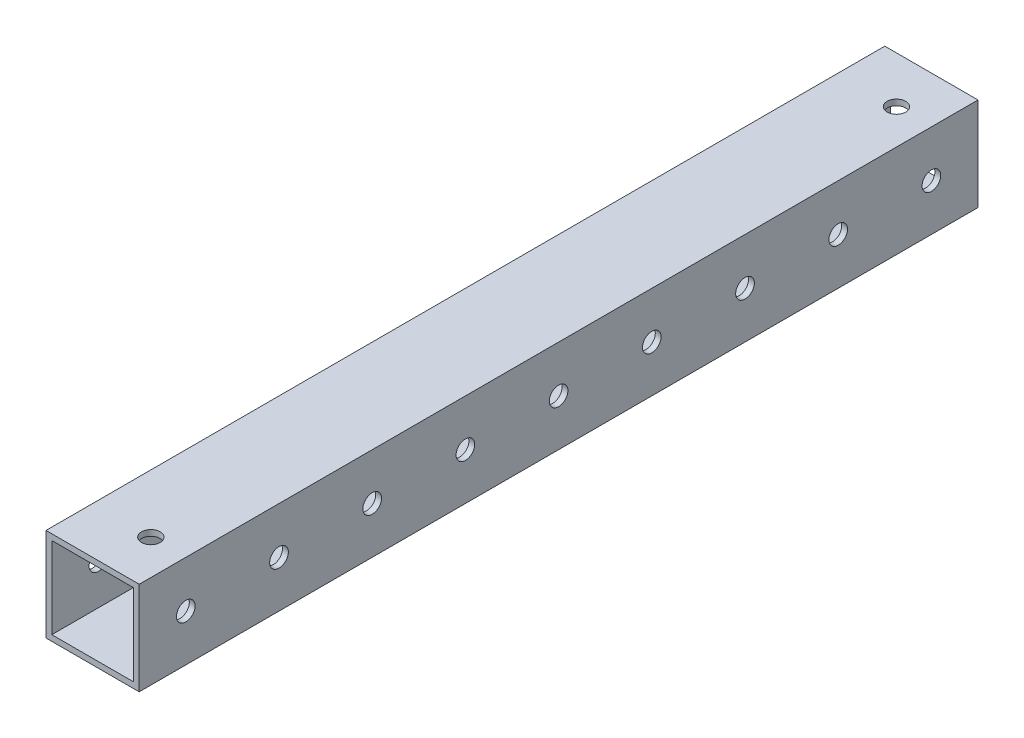
ISO-10303-21;
HEADER;
FILE_DESCRIPTION(('STEP AP214'),'2;1');
FILE_NAME('part.step','',(''),(''),'','','');
FILE_SCHEMA(('AUTOMOTIVE_DESIGN { 1 0 10303 214 1 1 1 1 }'));
ENDSEC;
DATA;
#1=APPLICATION_CONTEXT('core data for automotive mechanical design processes');
#2=APPLICATION_PROTOCOL_DEFINITION('international standard','automotive_design',2000,#1);
#3=PRODUCT_CONTEXT('',#1,'mechanical');
#4=PRODUCT('Part','Part','',(#3));
#5=PRODUCT_RELATED_PRODUCT_CATEGORY('part','',(#4));
#6=PRODUCT_DEFINITION_FORMATION('','',#4);
#7=PRODUCT_DEFINITION_CONTEXT('part definition',#1,'design');
#8=PRODUCT_DEFINITION('design','',#6,#7);
#9=PRODUCT_DEFINITION_SHAPE('','',#8);
#10=(LENGTH_UNIT() NAMED_UNIT(*) SI_UNIT(.MILLI.,.METRE.));
#11=(NAMED_UNIT(*) PLANE_ANGLE_UNIT() SI_UNIT($,.RADIAN.));
#12=(NAMED_UNIT(*) SI_UNIT($,.STERADIAN.) SOLID_ANGLE_UNIT());
#13=UNCERTAINTY_MEASURE_WITH_UNIT(LENGTH_MEASURE(1.E-05),#10,'distance_accuracy_value','');
#14=(GEOMETRIC_REPRESENTATION_CONTEXT(3) GLOBAL_UNCERTAINTY_ASSIGNED_CONTEXT((#13)) GLOBAL_UNIT_ASSIGNED_CONTEXT((#10,
#11,#12)) REPRESENTATION_CONTEXT('',''));
#15=CARTESIAN_POINT('',(0.,0.,0.));
#16=DIRECTION('',(0.,0.,1.));
#17=DIRECTION('',(1.,0.,0.));
#18=AXIS2_PLACEMENT_3D('',#15,#16,#17);
#19=CARTESIAN_POINT('',(0.,0.,228.6));
#20=DIRECTION('',(0.,0.,-1.));
#21=DIRECTION('',(-1.,0.,0.));
#22=AXIS2_PLACEMENT_3D('',#19,#20,#21);
#23=PLANE('',#22);
#24=DIRECTION('',(0.,-1.,0.));
#25=VECTOR('',#24,1.);
#26=CARTESIAN_POINT('',(0.,0.,228.6));
#27=LINE('',#26,#25);
#28=CARTESIAN_POINT('',(0.,25.4,228.6));
#29=VERTEX_POINT('',#28);
#30=CARTESIAN_POINT('',(0.,0.,228.6));
#31=VERTEX_POINT('',#30);
#32=EDGE_CURVE('E157',#29,#31,#27,.T.);
#33=ORIENTED_EDGE('',*,*,#32,.T.);
#34=DIRECTION('',(1.,0.,0.));
#35=VECTOR('',#34,1.);
#36=CARTESIAN_POINT('',(0.,0.,228.6));
#37=LINE('',#36,#35);
#38=CARTESIAN_POINT('',(25.4,0.,228.6));
#39=VERTEX_POINT('',#38);
#40=EDGE_CURVE('E161',#31,#39,#37,.T.);
#41=ORIENTED_EDGE('',*,*,#40,.T.);
#42=DIRECTION('',(0.,1.,0.));
#43=VECTOR('',#42,1.);
#44=CARTESIAN_POINT('',(25.4,0.,228.6));
#45=LINE('',#44,#43);
#46=CARTESIAN_POINT('',(25.4,25.4,228.6));
#47=VERTEX_POINT('',#46);
#48=EDGE_CURVE('E165',#39,#47,#45,.T.);
#49=ORIENTED_EDGE('',*,*,#48,.T.);
#50=DIRECTION('',(-1.,0.,0.));
#51=VECTOR('',#50,1.);
#52=CARTESIAN_POINT('',(0.,25.4,228.6));
#53=LINE('',#52,#51);
#54=EDGE_CURVE('E168',#47,#29,#53,.T.);
#55=ORIENTED_EDGE('',*,*,#54,.T.);
#56=EDGE_LOOP('',(#33,#41,#49,#55));
#57=FACE_BOUND('',#56,.T.);
#58=DIRECTION('',(0.,-1.,0.));
#59=VECTOR('',#58,1.);
#60=CARTESIAN_POINT('',(1.5875,1.5875,228.6));
#61=LINE('',#60,#59);
#62=CARTESIAN_POINT('',(1.5875,23.8125,228.6));
#63=VERTEX_POINT('',#62);
#64=CARTESIAN_POINT('',(1.5875,1.5875,228.6));
#65=VERTEX_POINT('',#64);
#66=EDGE_CURVE('E107',#63,#65,#61,.T.);
#67=ORIENTED_EDGE('',*,*,#66,.F.);
#68=DIRECTION('',(-1.,0.,0.));
#69=VECTOR('',#68,1.);
#70=CARTESIAN_POINT('',(1.5875,23.8125,228.6));
#71=LINE('',#70,#69);
#72=CARTESIAN_POINT('',(23.8125,23.8125,228.6));
#73=VERTEX_POINT('',#72);
#74=EDGE_CURVE('E133',#73,#63,#71,.T.);
#75=ORIENTED_EDGE('',*,*,#74,.F.);
#76=DIRECTION('',(0.,1.,0.));
#77=VECTOR('',#76,1.);
#78=CARTESIAN_POINT('',(23.8125,1.5875,228.6));
#79=LINE('',#78,#77);
#80=CARTESIAN_POINT('',(23.8125,1.5875,228.6));
#81=VERTEX_POINT('',#80);
#82=EDGE_CURVE('E129',#81,#73,#79,.T.);
#83=ORIENTED_EDGE('',*,*,#82,.F.);
#84=DIRECTION('',(1.,0.,0.));
#85=VECTOR('',#84,1.);
#86=CARTESIAN_POINT('',(1.5875,1.5875,228.6));
#87=LINE('',#86,#85);
#88=EDGE_CURVE('E116',#65,#81,#87,.T.);
#89=ORIENTED_EDGE('',*,*,#88,.F.);
#90=EDGE_LOOP('',(#67,#75,#83,#89));
#91=FACE_BOUND('',#90,.T.);
#92=ADVANCED_FACE('F39',(#57,#91),#23,.F.);
#93=CARTESIAN_POINT('',(0.,0.,0.));
#94=DIRECTION('',(0.,0.,-1.));
#95=DIRECTION('',(-1.,0.,0.));
#96=AXIS2_PLACEMENT_3D('',#93,#94,#95);
#97=PLANE('',#96);
#98=DIRECTION('',(0.,-1.,0.));
#99=VECTOR('',#98,1.);
#100=CARTESIAN_POINT('',(0.,0.,0.));
#101=LINE('',#100,#99);
#102=CARTESIAN_POINT('',(0.,25.4,0.));
#103=VERTEX_POINT('',#102);
#104=CARTESIAN_POINT('',(0.,0.,0.));
#105=VERTEX_POINT('',#104);
#106=EDGE_CURVE('E125',#103,#105,#101,.T.);
#107=ORIENTED_EDGE('',*,*,#106,.F.);
#108=DIRECTION('',(-1.,0.,0.));
#109=VECTOR('',#108,1.);
#110=CARTESIAN_POINT('',(0.,25.4,0.));
#111=LINE('',#110,#109);
#112=CARTESIAN_POINT('',(25.4,25.4,0.));
#113=VERTEX_POINT('',#112);
#114=EDGE_CURVE('E162',#113,#103,#111,.T.);
#115=ORIENTED_EDGE('',*,*,#114,.F.);
#116=DIRECTION('',(0.,1.,0.));
#117=VECTOR('',#116,1.);
#118=CARTESIAN_POINT('',(25.4,0.,0.));
#119=LINE('',#118,#117);
#120=CARTESIAN_POINT('',(25.4,0.,0.));
#121=VERTEX_POINT('',#120);
#122=EDGE_CURVE('E178',#121,#113,#119,.T.);
#123=ORIENTED_EDGE('',*,*,#122,.F.);
#124=DIRECTION('',(1.,0.,0.));
#125=VECTOR('',#124,1.);
#126=CARTESIAN_POINT('',(0.,0.,0.));
#127=LINE('',#126,#125);
#128=EDGE_CURVE('E175',#105,#121,#127,.T.);
#129=ORIENTED_EDGE('',*,*,#128,.F.);
#130=EDGE_LOOP('',(#107,#115,#123,#129));
#131=FACE_BOUND('',#130,.T.);
#132=DIRECTION('',(-1.,0.,0.));
#133=VECTOR('',#132,1.);
#134=CARTESIAN_POINT('',(1.5875,23.8125,0.));
#135=LINE('',#134,#133);
#136=CARTESIAN_POINT('',(23.8125,23.8125,0.));
#137=VERTEX_POINT('',#136);
#138=CARTESIAN_POINT('',(1.5875,23.8125,0.));
#139=VERTEX_POINT('',#138);
#140=EDGE_CURVE('E117',#137,#139,#135,.T.);
#141=ORIENTED_EDGE('',*,*,#140,.T.);
#142=DIRECTION('',(0.,-1.,0.));
#143=VECTOR('',#142,1.);
#144=CARTESIAN_POINT('',(1.5875,1.5875,0.));
#145=LINE('',#144,#143);
#146=CARTESIAN_POINT('',(1.5875,1.5875,0.));
#147=VERTEX_POINT('',#146);
#148=EDGE_CURVE('E65',#139,#147,#145,.T.);
#149=ORIENTED_EDGE('',*,*,#148,.T.);
#150=DIRECTION('',(1.,0.,0.));
#151=VECTOR('',#150,1.);
#152=CARTESIAN_POINT('',(1.5875,1.5875,0.));
#153=LINE('',#152,#151);
#154=CARTESIAN_POINT('',(23.8125,1.5875,0.));
#155=VERTEX_POINT('',#154);
#156=EDGE_CURVE('E123',#147,#155,#153,.T.);
#157=ORIENTED_EDGE('',*,*,#156,.T.);
#158=DIRECTION('',(0.,1.,0.));
#159=VECTOR('',#158,1.);
#160=CARTESIAN_POINT('',(23.8125,1.5875,0.));
#161=LINE('',#160,#159);
#162=EDGE_CURVE('E144',#155,#137,#161,.T.);
#163=ORIENTED_EDGE('',*,*,#162,.T.);
#164=EDGE_LOOP('',(#141,#149,#157,#163));
#165=FACE_BOUND('',#164,.T.);
#166=ADVANCED_FACE('F311',(#131,#165),#97,.T.);
#167=CARTESIAN_POINT('',(0.,0.,228.6));
#168=DIRECTION('',(1.,0.,0.));
#169=DIRECTION('',(0.,0.,-1.));
#170=AXIS2_PLACEMENT_3D('',#167,#168,#169);
#171=PLANE('',#170);
#172=CARTESIAN_POINT('',(0.,12.7,215.9));
#173=DIRECTION('',(1.,0.,0.));
#174=DIRECTION('',(0.,0.,-1.));
#175=AXIS2_PLACEMENT_3D('',#172,#173,#174);
#176=CIRCLE('',#175,2.53999999999998);
#177=CARTESIAN_POINT('',(0.,12.7,213.36));
#178=VERTEX_POINT('',#177);
#179=EDGE_CURVE('E208',#178,#178,#176,.T.);
#180=ORIENTED_EDGE('',*,*,#179,.T.);
#181=EDGE_LOOP('',(#180));
#182=FACE_BOUND('',#181,.T.);
#183=CARTESIAN_POINT('',(0.,12.7,190.5));
#184=DIRECTION('',(1.,0.,0.));
#185=DIRECTION('',(0.,0.,-1.));
#186=AXIS2_PLACEMENT_3D('',#183,#184,#185);
#187=CIRCLE('',#186,2.53999999999998);
#188=CARTESIAN_POINT('',(0.,12.7,187.96));
#189=VERTEX_POINT('',#188);
#190=EDGE_CURVE('E427',#189,#189,#187,.T.);
#191=ORIENTED_EDGE('',*,*,#190,.T.);
#192=EDGE_LOOP('',(#191));
#193=FACE_BOUND('',#192,.T.);
#194=CARTESIAN_POINT('',(0.,12.7,165.1));
#195=DIRECTION('',(1.,0.,0.));
#196=DIRECTION('',(0.,0.,-1.));
#197=AXIS2_PLACEMENT_3D('',#194,#195,#196);
#198=CIRCLE('',#197,2.54000000000001);
#199=CARTESIAN_POINT('',(0.,12.7,162.56));
#200=VERTEX_POINT('',#199);
#201=EDGE_CURVE('E431',#200,#200,#198,.T.);
#202=ORIENTED_EDGE('',*,*,#201,.T.);
#203=EDGE_LOOP('',(#202));
#204=FACE_BOUND('',#203,.T.);
#205=CARTESIAN_POINT('',(0.,12.7,139.7));
#206=DIRECTION('',(1.,0.,0.));
#207=DIRECTION('',(0.,0.,-1.));
#208=AXIS2_PLACEMENT_3D('',#205,#206,#207);
#209=CIRCLE('',#208,2.53999999999998);
#210=CARTESIAN_POINT('',(0.,12.7,137.16));
#211=VERTEX_POINT('',#210);
#212=EDGE_CURVE('E435',#211,#211,#209,.T.);
#213=ORIENTED_EDGE('',*,*,#212,.T.);
#214=EDGE_LOOP('',(#213));
#215=FACE_BOUND('',#214,.T.);
#216=CARTESIAN_POINT('',(0.,12.7,114.3));
#217=DIRECTION('',(1.,0.,0.));
#218=DIRECTION('',(0.,0.,-1.));
#219=AXIS2_PLACEMENT_3D('',#216,#217,#218);
#220=CIRCLE('',#219,2.53999999999998);
#221=CARTESIAN_POINT('',(0.,12.7,111.76));
#222=VERTEX_POINT('',#221);
#223=EDGE_CURVE('E439',#222,#222,#220,.T.);
#224=ORIENTED_EDGE('',*,*,#223,.T.);
#225=EDGE_LOOP('',(#224));
#226=FACE_BOUND('',#225,.T.);
#227=CARTESIAN_POINT('',(0.,12.7,88.9));
#228=DIRECTION('',(1.,0.,0.));
#229=DIRECTION('',(0.,0.,-1.));
#230=AXIS2_PLACEMENT_3D('',#227,#228,#229);
#231=CIRCLE('',#230,2.53999999999998);
#232=CARTESIAN_POINT('',(0.,12.7,86.36));
#233=VERTEX_POINT('',#232);
#234=EDGE_CURVE('E443',#233,#233,#231,.T.);
#235=ORIENTED_EDGE('',*,*,#234,.T.);
#236=EDGE_LOOP('',(#235));
#237=FACE_BOUND('',#236,.T.);
#238=CARTESIAN_POINT('',(0.,12.7,63.5));
#239=DIRECTION('',(1.,0.,0.));
#240=DIRECTION('',(0.,0.,-1.));
#241=AXIS2_PLACEMENT_3D('',#238,#239,#240);
#242=CIRCLE('',#241,2.53999999999998);
#243=CARTESIAN_POINT('',(0.,12.7,60.9600000000001));
#244=VERTEX_POINT('',#243);
#245=EDGE_CURVE('E447',#244,#244,#242,.T.);
#246=ORIENTED_EDGE('',*,*,#245,.T.);
#247=EDGE_LOOP('',(#246));
#248=FACE_BOUND('',#247,.T.);
#249=CARTESIAN_POINT('',(0.,12.7,38.1));
#250=DIRECTION('',(1.,0.,0.));
#251=DIRECTION('',(0.,0.,-1.));
#252=AXIS2_PLACEMENT_3D('',#249,#250,#251);
#253=CIRCLE('',#252,2.53999999999998);
#254=CARTESIAN_POINT('',(0.,12.7,35.56));
#255=VERTEX_POINT('',#254);
#256=EDGE_CURVE('E450',#255,#255,#253,.T.);
#257=ORIENTED_EDGE('',*,*,#256,.T.);
#258=EDGE_LOOP('',(#257));
#259=FACE_BOUND('',#258,.T.);
#260=CARTESIAN_POINT('',(0.,12.7,12.7));
#261=DIRECTION('',(1.,0.,0.));
#262=DIRECTION('',(0.,0.,-1.));
#263=AXIS2_PLACEMENT_3D('',#260,#261,#262);
#264=CIRCLE('',#263,2.53999999999998);
#265=CARTESIAN_POINT('',(0.,12.7,10.16));
#266=VERTEX_POINT('',#265);
#267=EDGE_CURVE('E372',#266,#266,#264,.T.);
#268=ORIENTED_EDGE('',*,*,#267,.T.);
#269=EDGE_LOOP('',(#268));
#270=FACE_BOUND('',#269,.T.);
#271=ORIENTED_EDGE('',*,*,#106,.T.);
#272=DIRECTION('',(0.,0.,-1.));
#273=VECTOR('',#272,1.);
#274=CARTESIAN_POINT('',(0.,0.,228.6));
#275=LINE('',#274,#273);
#276=EDGE_CURVE('E11',#31,#105,#275,.T.);
#277=ORIENTED_EDGE('',*,*,#276,.F.);
#278=ORIENTED_EDGE('',*,*,#32,.F.);
#279=DIRECTION('',(0.,0.,-1.));
#280=VECTOR('',#279,1.);
#281=CARTESIAN_POINT('',(0.,25.4,228.6));
#282=LINE('',#281,#280);
#283=EDGE_CURVE('E171',#29,#103,#282,.T.);
#284=ORIENTED_EDGE('',*,*,#283,.T.);
#285=EDGE_LOOP('',(#271,#277,#278,#284));
#286=FACE_BOUND('',#285,.T.);
#287=ADVANCED_FACE('F41',(#182,#193,#204,#215,#226,#237,#248,#259,#270,#286),#171,.F.);
#288=CARTESIAN_POINT('',(0.,0.,228.6));
#289=DIRECTION('',(0.,1.,0.));
#290=DIRECTION('',(0.,0.,1.));
#291=AXIS2_PLACEMENT_3D('',#288,#289,#290);
#292=PLANE('',#291);
#293=CARTESIAN_POINT('',(15.875,0.,215.9));
#294=DIRECTION('',(0.,1.,0.));
#295=DIRECTION('',(0.,0.,1.));
#296=AXIS2_PLACEMENT_3D('',#293,#294,#295);
#297=CIRCLE('',#296,2.53999999999996);
#298=CARTESIAN_POINT('',(15.875,0.,218.44));
#299=VERTEX_POINT('',#298);
#300=EDGE_CURVE('E198',#299,#299,#297,.T.);
#301=ORIENTED_EDGE('',*,*,#300,.T.);
#302=EDGE_LOOP('',(#301));
#303=FACE_BOUND('',#302,.T.);
#304=CARTESIAN_POINT('',(15.875,0.,12.7));
#305=DIRECTION('',(0.,1.,0.));
#306=DIRECTION('',(0.,0.,1.));
#307=AXIS2_PLACEMENT_3D('',#304,#305,#306);
#308=CIRCLE('',#307,2.54);
#309=CARTESIAN_POINT('',(15.875,0.,15.24));
#310=VERTEX_POINT('',#309);
#311=EDGE_CURVE('E267',#310,#310,#308,.T.);
#312=ORIENTED_EDGE('',*,*,#311,.T.);
#313=EDGE_LOOP('',(#312));
#314=FACE_BOUND('',#313,.T.);
#315=ORIENTED_EDGE('',*,*,#128,.T.);
#316=DIRECTION('',(0.,0.,-1.));
#317=VECTOR('',#316,1.);
#318=CARTESIAN_POINT('',(25.4,0.,228.6));
#319=LINE('',#318,#317);
#320=EDGE_CURVE('E49',#39,#121,#319,.T.);
#321=ORIENTED_EDGE('',*,*,#320,.F.);
#322=ORIENTED_EDGE('',*,*,#40,.F.);
#323=ORIENTED_EDGE('',*,*,#276,.T.);
#324=EDGE_LOOP('',(#315,#321,#322,#323));
#325=FACE_BOUND('',#324,.T.);
#326=ADVANCED_FACE('F297',(#303,#314,#325),#292,.F.);
#327=CARTESIAN_POINT('',(25.4,0.,228.6));
#328=DIRECTION('',(-1.,0.,0.));
#329=DIRECTION('',(0.,0.,1.));
#330=AXIS2_PLACEMENT_3D('',#327,#328,#329);
#331=PLANE('',#330);
#332=CARTESIAN_POINT('',(25.4,12.7,215.9));
#333=DIRECTION('',(1.,0.,0.));
#334=DIRECTION('',(0.,0.,-1.));
#335=AXIS2_PLACEMENT_3D('',#332,#333,#334);
#336=CIRCLE('',#335,2.53999999999998);
#337=CARTESIAN_POINT('',(25.4,12.7,213.36));
#338=VERTEX_POINT('',#337);
#339=EDGE_CURVE('E338',#338,#338,#336,.T.);
#340=ORIENTED_EDGE('',*,*,#339,.F.);
#341=EDGE_LOOP('',(#340));
#342=FACE_BOUND('',#341,.T.);
#343=CARTESIAN_POINT('',(25.4,12.7,190.5));
#344=DIRECTION('',(1.,0.,0.));
#345=DIRECTION('',(0.,0.,-1.));
#346=AXIS2_PLACEMENT_3D('',#343,#344,#345);
#347=CIRCLE('',#346,2.53999999999998);
#348=CARTESIAN_POINT('',(25.4,12.7,187.96));
#349=VERTEX_POINT('',#348);
#350=EDGE_CURVE('E342',#349,#349,#347,.T.);
#351=ORIENTED_EDGE('',*,*,#350,.F.);
#352=EDGE_LOOP('',(#351));
#353=FACE_BOUND('',#352,.T.);
#354=CARTESIAN_POINT('',(25.4,12.7,165.1));
#355=DIRECTION('',(1.,0.,0.));
#356=DIRECTION('',(0.,0.,-1.));
#357=AXIS2_PLACEMENT_3D('',#354,#355,#356);
#358=CIRCLE('',#357,2.54000000000001);
#359=CARTESIAN_POINT('',(25.4,12.7,162.56));
#360=VERTEX_POINT('',#359);
#361=EDGE_CURVE('E346',#360,#360,#358,.T.);
#362=ORIENTED_EDGE('',*,*,#361,.F.);
#363=EDGE_LOOP('',(#362));
#364=FACE_BOUND('',#363,.T.);
#365=CARTESIAN_POINT('',(25.4,12.7,139.7));
#366=DIRECTION('',(1.,0.,0.));
#367=DIRECTION('',(0.,0.,-1.));
#368=AXIS2_PLACEMENT_3D('',#365,#366,#367);
#369=CIRCLE('',#368,2.53999999999998);
#370=CARTESIAN_POINT('',(25.4,12.7,137.16));
#371=VERTEX_POINT('',#370);
#372=EDGE_CURVE('E350',#371,#371,#369,.T.);
#373=ORIENTED_EDGE('',*,*,#372,.F.);
#374=EDGE_LOOP('',(#373));
#375=FACE_BOUND('',#374,.T.);
#376=CARTESIAN_POINT('',(25.4,12.7,114.3));
#377=DIRECTION('',(1.,0.,0.));
#378=DIRECTION('',(0.,0.,-1.));
#379=AXIS2_PLACEMENT_3D('',#376,#377,#378);
#380=CIRCLE('',#379,2.53999999999998);
#381=CARTESIAN_POINT('',(25.4,12.7,111.76));
#382=VERTEX_POINT('',#381);
#383=EDGE_CURVE('E354',#382,#382,#380,.T.);
#384=ORIENTED_EDGE('',*,*,#383,.F.);
#385=EDGE_LOOP('',(#384));
#386=FACE_BOUND('',#385,.T.);
#387=CARTESIAN_POINT('',(25.4,12.7,88.9));
#388=DIRECTION('',(1.,0.,0.));
#389=DIRECTION('',(0.,0.,-1.));
#390=AXIS2_PLACEMENT_3D('',#387,#388,#389);
#391=CIRCLE('',#390,2.53999999999998);
#392=CARTESIAN_POINT('',(25.4,12.7,86.36));
#393=VERTEX_POINT('',#392);
#394=EDGE_CURVE('E358',#393,#393,#391,.T.);
#395=ORIENTED_EDGE('',*,*,#394,.F.);
#396=EDGE_LOOP('',(#395));
#397=FACE_BOUND('',#396,.T.);
#398=CARTESIAN_POINT('',(25.4,12.7,63.5));
#399=DIRECTION('',(1.,0.,0.));
#400=DIRECTION('',(0.,0.,-1.));
#401=AXIS2_PLACEMENT_3D('',#398,#399,#400);
#402=CIRCLE('',#401,2.53999999999998);
#403=CARTESIAN_POINT('',(25.4,12.7,60.9600000000001));
#404=VERTEX_POINT('',#403);
#405=EDGE_CURVE('E362',#404,#404,#402,.T.);
#406=ORIENTED_EDGE('',*,*,#405,.F.);
#407=EDGE_LOOP('',(#406));
#408=FACE_BOUND('',#407,.T.);
#409=CARTESIAN_POINT('',(25.4,12.7,38.1));
#410=DIRECTION('',(1.,0.,0.));
#411=DIRECTION('',(0.,0.,-1.));
#412=AXIS2_PLACEMENT_3D('',#409,#410,#411);
#413=CIRCLE('',#412,2.53999999999998);
#414=CARTESIAN_POINT('',(25.4,12.7,35.56));
#415=VERTEX_POINT('',#414);
#416=EDGE_CURVE('E366',#415,#415,#413,.T.);
#417=ORIENTED_EDGE('',*,*,#416,.F.);
#418=EDGE_LOOP('',(#417));
#419=FACE_BOUND('',#418,.T.);
#420=CARTESIAN_POINT('',(25.4,12.7,12.7));
#421=DIRECTION('',(1.,0.,0.));
#422=DIRECTION('',(0.,0.,-1.));
#423=AXIS2_PLACEMENT_3D('',#420,#421,#422);
#424=CIRCLE('',#423,2.53999999999998);
#425=CARTESIAN_POINT('',(25.4,12.7,10.16));
#426=VERTEX_POINT('',#425);
#427=EDGE_CURVE('E369',#426,#426,#424,.T.);
#428=ORIENTED_EDGE('',*,*,#427,.F.);
#429=EDGE_LOOP('',(#428));
#430=FACE_BOUND('',#429,.T.);
#431=ORIENTED_EDGE('',*,*,#122,.T.);
#432=DIRECTION('',(0.,0.,-1.));
#433=VECTOR('',#432,1.);
#434=CARTESIAN_POINT('',(25.4,25.4,228.6));
#435=LINE('',#434,#433);
#436=EDGE_CURVE('E186',#47,#113,#435,.T.);
#437=ORIENTED_EDGE('',*,*,#436,.F.);
#438=ORIENTED_EDGE('',*,*,#48,.F.);
#439=ORIENTED_EDGE('',*,*,#320,.T.);
#440=EDGE_LOOP('',(#431,#437,#438,#439));
#441=FACE_BOUND('',#440,.T.);
#442=ADVANCED_FACE('F300',(#342,#353,#364,#375,#386,#397,#408,#419,#430,#441),#331,.F.);
#443=CARTESIAN_POINT('',(0.,25.4,228.6));
#444=DIRECTION('',(0.,-1.,0.));
#445=DIRECTION('',(0.,0.,-1.));
#446=AXIS2_PLACEMENT_3D('',#443,#444,#445);
#447=PLANE('',#446);
#448=CARTESIAN_POINT('',(15.875,25.4,215.9));
#449=DIRECTION('',(0.,1.,0.));
#450=DIRECTION('',(0.,0.,1.));
#451=AXIS2_PLACEMENT_3D('',#448,#449,#450);
#452=CIRCLE('',#451,2.53999999999996);
#453=CARTESIAN_POINT('',(15.875,25.4,218.44));
#454=VERTEX_POINT('',#453);
#455=EDGE_CURVE('E263',#454,#454,#452,.T.);
#456=ORIENTED_EDGE('',*,*,#455,.F.);
#457=EDGE_LOOP('',(#456));
#458=FACE_BOUND('',#457,.T.);
#459=CARTESIAN_POINT('',(15.875,25.4,12.7));
#460=DIRECTION('',(0.,1.,0.));
#461=DIRECTION('',(0.,0.,1.));
#462=AXIS2_PLACEMENT_3D('',#459,#460,#461);
#463=CIRCLE('',#462,2.54);
#464=CARTESIAN_POINT('',(15.875,25.4,15.24));
#465=VERTEX_POINT('',#464);
#466=EDGE_CURVE('E259',#465,#465,#463,.T.);
#467=ORIENTED_EDGE('',*,*,#466,.F.);
#468=EDGE_LOOP('',(#467));
#469=FACE_BOUND('',#468,.T.);
#470=ORIENTED_EDGE('',*,*,#114,.T.);
#471=ORIENTED_EDGE('',*,*,#283,.F.);
#472=ORIENTED_EDGE('',*,*,#54,.F.);
#473=ORIENTED_EDGE('',*,*,#436,.T.);
#474=EDGE_LOOP('',(#470,#471,#472,#473));
#475=FACE_BOUND('',#474,.T.);
#476=ADVANCED_FACE('F315',(#458,#469,#475),#447,.F.);
#477=CARTESIAN_POINT('',(1.5875,1.5875,228.6));
#478=DIRECTION('',(1.,0.,0.));
#479=DIRECTION('',(0.,0.,-1.));
#480=AXIS2_PLACEMENT_3D('',#477,#478,#479);
#481=PLANE('',#480);
#482=CARTESIAN_POINT('',(1.5875,12.7,215.9));
#483=DIRECTION('',(1.,0.,0.));
#484=DIRECTION('',(0.,0.,-1.));
#485=AXIS2_PLACEMENT_3D('',#482,#483,#484);
#486=CIRCLE('',#485,2.53999999999998);
#487=CARTESIAN_POINT('',(1.5875,12.7,213.36));
#488=VERTEX_POINT('',#487);
#489=EDGE_CURVE('E255',#488,#488,#486,.T.);
#490=ORIENTED_EDGE('',*,*,#489,.F.);
#491=EDGE_LOOP('',(#490));
#492=FACE_BOUND('',#491,.T.);
#493=CARTESIAN_POINT('',(1.5875,12.7,190.5));
#494=DIRECTION('',(1.,0.,0.));
#495=DIRECTION('',(0.,0.,-1.));
#496=AXIS2_PLACEMENT_3D('',#493,#494,#495);
#497=CIRCLE('',#496,2.53999999999998);
#498=CARTESIAN_POINT('',(1.5875,12.7,187.96));
#499=VERTEX_POINT('',#498);
#500=EDGE_CURVE('E241',#499,#499,#497,.T.);
#501=ORIENTED_EDGE('',*,*,#500,.F.);
#502=EDGE_LOOP('',(#501));
#503=FACE_BOUND('',#502,.T.);
#504=CARTESIAN_POINT('',(1.5875,12.7,165.1));
#505=DIRECTION('',(1.,0.,0.));
#506=DIRECTION('',(0.,0.,-1.));
#507=AXIS2_PLACEMENT_3D('',#504,#505,#506);
#508=CIRCLE('',#507,2.54000000000001);
#509=CARTESIAN_POINT('',(1.5875,12.7,162.56));
#510=VERTEX_POINT('',#509);
#511=EDGE_CURVE('E237',#510,#510,#508,.T.);
#512=ORIENTED_EDGE('',*,*,#511,.F.);
#513=EDGE_LOOP('',(#512));
#514=FACE_BOUND('',#513,.T.);
#515=CARTESIAN_POINT('',(1.5875,12.7,139.7));
#516=DIRECTION('',(1.,0.,0.));
#517=DIRECTION('',(0.,0.,-1.));
#518=AXIS2_PLACEMENT_3D('',#515,#516,#517);
#519=CIRCLE('',#518,2.53999999999998);
#520=CARTESIAN_POINT('',(1.5875,12.7,137.16));
#521=VERTEX_POINT('',#520);
#522=EDGE_CURVE('E233',#521,#521,#519,.T.);
#523=ORIENTED_EDGE('',*,*,#522,.F.);
#524=EDGE_LOOP('',(#523));
#525=FACE_BOUND('',#524,.T.);
#526=CARTESIAN_POINT('',(1.5875,12.7,114.3));
#527=DIRECTION('',(1.,0.,0.));
#528=DIRECTION('',(0.,0.,-1.));
#529=AXIS2_PLACEMENT_3D('',#526,#527,#528);
#530=CIRCLE('',#529,2.53999999999998);
#531=CARTESIAN_POINT('',(1.5875,12.7,111.76));
#532=VERTEX_POINT('',#531);
#533=EDGE_CURVE('E228',#532,#532,#530,.T.);
#534=ORIENTED_EDGE('',*,*,#533,.F.);
#535=EDGE_LOOP('',(#534));
#536=FACE_BOUND('',#535,.T.);
#537=CARTESIAN_POINT('',(1.5875,12.7,88.9));
#538=DIRECTION('',(1.,0.,0.));
#539=DIRECTION('',(0.,0.,-1.));
#540=AXIS2_PLACEMENT_3D('',#537,#538,#539);
#541=CIRCLE('',#540,2.53999999999998);
#542=CARTESIAN_POINT('',(1.5875,12.7,86.36));
#543=VERTEX_POINT('',#542);
#544=EDGE_CURVE('E223',#543,#543,#541,.T.);
#545=ORIENTED_EDGE('',*,*,#544,.F.);
#546=EDGE_LOOP('',(#545));
#547=FACE_BOUND('',#546,.T.);
#548=CARTESIAN_POINT('',(1.5875,12.7,63.5));
#549=DIRECTION('',(1.,0.,0.));
#550=DIRECTION('',(0.,0.,-1.));
#551=AXIS2_PLACEMENT_3D('',#548,#549,#550);
#552=CIRCLE('',#551,2.53999999999998);
#553=CARTESIAN_POINT('',(1.5875,12.7,60.9600000000001));
#554=VERTEX_POINT('',#553);
#555=EDGE_CURVE('E218',#554,#554,#552,.T.);
#556=ORIENTED_EDGE('',*,*,#555,.F.);
#557=EDGE_LOOP('',(#556));
#558=FACE_BOUND('',#557,.T.);
#559=CARTESIAN_POINT('',(1.5875,12.7,38.1));
#560=DIRECTION('',(1.,0.,0.));
#561=DIRECTION('',(0.,0.,-1.));
#562=AXIS2_PLACEMENT_3D('',#559,#560,#561);
#563=CIRCLE('',#562,2.53999999999998);
#564=CARTESIAN_POINT('',(1.5875,12.7,35.56));
#565=VERTEX_POINT('',#564);
#566=EDGE_CURVE('E213',#565,#565,#563,.T.);
#567=ORIENTED_EDGE('',*,*,#566,.F.);
#568=EDGE_LOOP('',(#567));
#569=FACE_BOUND('',#568,.T.);
#570=CARTESIAN_POINT('',(1.5875,12.7,12.7));
#571=DIRECTION('',(1.,0.,0.));
#572=DIRECTION('',(0.,0.,-1.));
#573=AXIS2_PLACEMENT_3D('',#570,#571,#572);
#574=CIRCLE('',#573,2.53999999999998);
#575=CARTESIAN_POINT('',(1.5875,12.7,10.16));
#576=VERTEX_POINT('',#575);
#577=EDGE_CURVE('E207',#576,#576,#574,.T.);
#578=ORIENTED_EDGE('',*,*,#577,.F.);
#579=EDGE_LOOP('',(#578));
#580=FACE_BOUND('',#579,.T.);
#581=ORIENTED_EDGE('',*,*,#148,.F.);
#582=DIRECTION('',(0.,0.,-1.));
#583=VECTOR('',#582,1.);
#584=CARTESIAN_POINT('',(1.5875,23.8125,228.6));
#585=LINE('',#584,#583);
#586=EDGE_CURVE('E111',#63,#139,#585,.T.);
#587=ORIENTED_EDGE('',*,*,#586,.F.);
#588=ORIENTED_EDGE('',*,*,#66,.T.);
#589=DIRECTION('',(0.,0.,-1.));
#590=VECTOR('',#589,1.);
#591=CARTESIAN_POINT('',(1.5875,1.5875,228.6));
#592=LINE('',#591,#590);
#593=EDGE_CURVE('E110',#65,#147,#592,.T.);
#594=ORIENTED_EDGE('',*,*,#593,.T.);
#595=EDGE_LOOP('',(#581,#587,#588,#594));
#596=FACE_BOUND('',#595,.T.);
#597=ADVANCED_FACE('F109',(#492,#503,#514,#525,#536,#547,#558,#569,#580,#596),#481,.T.);
#598=CARTESIAN_POINT('',(1.5875,1.5875,228.6));
#599=DIRECTION('',(0.,1.,0.));
#600=DIRECTION('',(0.,0.,1.));
#601=AXIS2_PLACEMENT_3D('',#598,#599,#600);
#602=PLANE('',#601);
#603=CARTESIAN_POINT('',(15.875,1.5875,215.9));
#604=DIRECTION('',(0.,1.,0.));
#605=DIRECTION('',(0.,0.,1.));
#606=AXIS2_PLACEMENT_3D('',#603,#604,#605);
#607=CIRCLE('',#606,2.53999999999996);
#608=CARTESIAN_POINT('',(15.875,1.5875,218.44));
#609=VERTEX_POINT('',#608);
#610=EDGE_CURVE('E141',#609,#609,#607,.T.);
#611=ORIENTED_EDGE('',*,*,#610,.F.);
#612=EDGE_LOOP('',(#611));
#613=FACE_BOUND('',#612,.T.);
#614=CARTESIAN_POINT('',(15.875,1.5875,12.7));
#615=DIRECTION('',(0.,1.,0.));
#616=DIRECTION('',(0.,0.,1.));
#617=AXIS2_PLACEMENT_3D('',#614,#615,#616);
#618=CIRCLE('',#617,2.54);
#619=CARTESIAN_POINT('',(15.875,1.5875,15.24));
#620=VERTEX_POINT('',#619);
#621=EDGE_CURVE('E197',#620,#620,#618,.T.);
#622=ORIENTED_EDGE('',*,*,#621,.F.);
#623=EDGE_LOOP('',(#622));
#624=FACE_BOUND('',#623,.T.);
#625=ORIENTED_EDGE('',*,*,#156,.F.);
#626=ORIENTED_EDGE('',*,*,#593,.F.);
#627=ORIENTED_EDGE('',*,*,#88,.T.);
#628=DIRECTION('',(0.,0.,-1.));
#629=VECTOR('',#628,1.);
#630=CARTESIAN_POINT('',(23.8125,1.5875,228.6));
#631=LINE('',#630,#629);
#632=EDGE_CURVE('E126',#81,#155,#631,.T.);
#633=ORIENTED_EDGE('',*,*,#632,.T.);
#634=EDGE_LOOP('',(#625,#626,#627,#633));
#635=FACE_BOUND('',#634,.T.);
#636=ADVANCED_FACE('F120',(#613,#624,#635),#602,.T.);
#637=CARTESIAN_POINT('',(23.8125,1.5875,228.6));
#638=DIRECTION('',(-1.,0.,0.));
#639=DIRECTION('',(0.,0.,1.));
#640=AXIS2_PLACEMENT_3D('',#637,#638,#639);
#641=PLANE('',#640);
#642=CARTESIAN_POINT('',(23.8125,12.7,215.9));
#643=DIRECTION('',(-1.,0.,0.));
#644=DIRECTION('',(0.,0.,1.));
#645=AXIS2_PLACEMENT_3D('',#642,#643,#644);
#646=CIRCLE('',#645,2.53999999999998);
#647=CARTESIAN_POINT('',(23.8125,12.7,218.44));
#648=VERTEX_POINT('',#647);
#649=EDGE_CURVE('E43',#648,#648,#646,.T.);
#650=ORIENTED_EDGE('',*,*,#649,.F.);
#651=EDGE_LOOP('',(#650));
#652=FACE_BOUND('',#651,.T.);
#653=CARTESIAN_POINT('',(23.8125,12.7,190.5));
#654=DIRECTION('',(-1.,0.,0.));
#655=DIRECTION('',(0.,0.,1.));
#656=AXIS2_PLACEMENT_3D('',#653,#654,#655);
#657=CIRCLE('',#656,2.53999999999998);
#658=CARTESIAN_POINT('',(23.8125,12.7,193.04));
#659=VERTEX_POINT('',#658);
#660=EDGE_CURVE('E238',#659,#659,#657,.T.);
#661=ORIENTED_EDGE('',*,*,#660,.F.);
#662=EDGE_LOOP('',(#661));
#663=FACE_BOUND('',#662,.T.);
#664=CARTESIAN_POINT('',(23.8125,12.7,165.1));
#665=DIRECTION('',(-1.,0.,0.));
#666=DIRECTION('',(0.,0.,1.));
#667=AXIS2_PLACEMENT_3D('',#664,#665,#666);
#668=CIRCLE('',#667,2.54000000000001);
#669=CARTESIAN_POINT('',(23.8125,12.7,167.64));
#670=VERTEX_POINT('',#669);
#671=EDGE_CURVE('E234',#670,#670,#668,.T.);
#672=ORIENTED_EDGE('',*,*,#671,.F.);
#673=EDGE_LOOP('',(#672));
#674=FACE_BOUND('',#673,.T.);
#675=CARTESIAN_POINT('',(23.8125,12.7,139.7));
#676=DIRECTION('',(-1.,0.,0.));
#677=DIRECTION('',(0.,0.,1.));
#678=AXIS2_PLACEMENT_3D('',#675,#676,#677);
#679=CIRCLE('',#678,2.53999999999998);
#680=CARTESIAN_POINT('',(23.8125,12.7,142.24));
#681=VERTEX_POINT('',#680);
#682=EDGE_CURVE('E229',#681,#681,#679,.T.);
#683=ORIENTED_EDGE('',*,*,#682,.F.);
#684=EDGE_LOOP('',(#683));
#685=FACE_BOUND('',#684,.T.);
#686=CARTESIAN_POINT('',(23.8125,12.7,114.3));
#687=DIRECTION('',(-1.,0.,0.));
#688=DIRECTION('',(0.,0.,1.));
#689=AXIS2_PLACEMENT_3D('',#686,#687,#688);
#690=CIRCLE('',#689,2.53999999999998);
#691=CARTESIAN_POINT('',(23.8125,12.7,116.84));
#692=VERTEX_POINT('',#691);
#693=EDGE_CURVE('E224',#692,#692,#690,.T.);
#694=ORIENTED_EDGE('',*,*,#693,.F.);
#695=EDGE_LOOP('',(#694));
#696=FACE_BOUND('',#695,.T.);
#697=CARTESIAN_POINT('',(23.8125,12.7,88.9));
#698=DIRECTION('',(-1.,0.,0.));
#699=DIRECTION('',(0.,0.,1.));
#700=AXIS2_PLACEMENT_3D('',#697,#698,#699);
#701=CIRCLE('',#700,2.53999999999998);
#702=CARTESIAN_POINT('',(23.8125,12.7,91.44));
#703=VERTEX_POINT('',#702);
#704=EDGE_CURVE('E219',#703,#703,#701,.T.);
#705=ORIENTED_EDGE('',*,*,#704,.F.);
#706=EDGE_LOOP('',(#705));
#707=FACE_BOUND('',#706,.T.);
#708=CARTESIAN_POINT('',(23.8125,12.7,63.5));
#709=DIRECTION('',(-1.,0.,0.));
#710=DIRECTION('',(0.,0.,1.));
#711=AXIS2_PLACEMENT_3D('',#708,#709,#710);
#712=CIRCLE('',#711,2.53999999999998);
#713=CARTESIAN_POINT('',(23.8125,12.7,66.04));
#714=VERTEX_POINT('',#713);
#715=EDGE_CURVE('E214',#714,#714,#712,.T.);
#716=ORIENTED_EDGE('',*,*,#715,.F.);
#717=EDGE_LOOP('',(#716));
#718=FACE_BOUND('',#717,.T.);
#719=CARTESIAN_POINT('',(23.8125,12.7,38.1));
#720=DIRECTION('',(-1.,0.,0.));
#721=DIRECTION('',(0.,0.,1.));
#722=AXIS2_PLACEMENT_3D('',#719,#720,#721);
#723=CIRCLE('',#722,2.53999999999998);
#724=CARTESIAN_POINT('',(23.8125,12.7,40.64));
#725=VERTEX_POINT('',#724);
#726=EDGE_CURVE('E209',#725,#725,#723,.T.);
#727=ORIENTED_EDGE('',*,*,#726,.F.);
#728=EDGE_LOOP('',(#727));
#729=FACE_BOUND('',#728,.T.);
#730=CARTESIAN_POINT('',(23.8125,12.7,12.7));
#731=DIRECTION('',(-1.,0.,0.));
#732=DIRECTION('',(0.,0.,1.));
#733=AXIS2_PLACEMENT_3D('',#730,#731,#732);
#734=CIRCLE('',#733,2.53999999999998);
#735=CARTESIAN_POINT('',(23.8125,12.7,15.24));
#736=VERTEX_POINT('',#735);
#737=EDGE_CURVE('E203',#736,#736,#734,.T.);
#738=ORIENTED_EDGE('',*,*,#737,.F.);
#739=EDGE_LOOP('',(#738));
#740=FACE_BOUND('',#739,.T.);
#741=ORIENTED_EDGE('',*,*,#162,.F.);
#742=ORIENTED_EDGE('',*,*,#632,.F.);
#743=ORIENTED_EDGE('',*,*,#82,.T.);
#744=DIRECTION('',(0.,0.,-1.));
#745=VECTOR('',#744,1.);
#746=CARTESIAN_POINT('',(23.8125,23.8125,228.6));
#747=LINE('',#746,#745);
#748=EDGE_CURVE('E57',#73,#137,#747,.T.);
#749=ORIENTED_EDGE('',*,*,#748,.T.);
#750=EDGE_LOOP('',(#741,#742,#743,#749));
#751=FACE_BOUND('',#750,.T.);
#752=ADVANCED_FACE('F285',(#652,#663,#674,#685,#696,#707,#718,#729,#740,#751),#641,.T.);
#753=CARTESIAN_POINT('',(1.5875,23.8125,228.6));
#754=DIRECTION('',(0.,-1.,0.));
#755=DIRECTION('',(0.,0.,-1.));
#756=AXIS2_PLACEMENT_3D('',#753,#754,#755);
#757=PLANE('',#756);
#758=CARTESIAN_POINT('',(15.875,23.8125,215.9));
#759=DIRECTION('',(0.,-1.,0.));
#760=DIRECTION('',(0.,0.,-1.));
#761=AXIS2_PLACEMENT_3D('',#758,#759,#760);
#762=CIRCLE('',#761,2.53999999999996);
#763=CARTESIAN_POINT('',(15.875,23.8125,213.36));
#764=VERTEX_POINT('',#763);
#765=EDGE_CURVE('E199',#764,#764,#762,.T.);
#766=ORIENTED_EDGE('',*,*,#765,.F.);
#767=EDGE_LOOP('',(#766));
#768=FACE_BOUND('',#767,.T.);
#769=CARTESIAN_POINT('',(15.875,23.8125,12.7));
#770=DIRECTION('',(0.,-1.,0.));
#771=DIRECTION('',(0.,0.,-1.));
#772=AXIS2_PLACEMENT_3D('',#769,#770,#771);
#773=CIRCLE('',#772,2.54);
#774=CARTESIAN_POINT('',(15.875,23.8125,10.16));
#775=VERTEX_POINT('',#774);
#776=EDGE_CURVE('E193',#775,#775,#773,.T.);
#777=ORIENTED_EDGE('',*,*,#776,.F.);
#778=EDGE_LOOP('',(#777));
#779=FACE_BOUND('',#778,.T.);
#780=ORIENTED_EDGE('',*,*,#140,.F.);
#781=ORIENTED_EDGE('',*,*,#748,.F.);
#782=ORIENTED_EDGE('',*,*,#74,.T.);
#783=ORIENTED_EDGE('',*,*,#586,.T.);
#784=EDGE_LOOP('',(#780,#781,#782,#783));
#785=FACE_BOUND('',#784,.T.);
#786=ADVANCED_FACE('F540',(#768,#779,#785),#757,.T.);
#787=CARTESIAN_POINT('',(15.875,0.,12.7));
#788=DIRECTION('',(0.,1.,0.));
#789=DIRECTION('',(0.,0.,1.));
#790=AXIS2_PLACEMENT_3D('',#787,#788,#789);
#791=CYLINDRICAL_SURFACE('',#790,2.54);
#792=ORIENTED_EDGE('',*,*,#776,.T.);
#793=EDGE_LOOP('',(#792));
#794=FACE_BOUND('',#793,.T.);
#795=ORIENTED_EDGE('',*,*,#466,.T.);
#796=EDGE_LOOP('',(#795));
#797=FACE_BOUND('',#796,.T.);
#798=ADVANCED_FACE('F294',(#794,#797),#791,.F.);
#799=CARTESIAN_POINT('',(15.875,0.,215.9));
#800=DIRECTION('',(0.,1.,0.));
#801=DIRECTION('',(0.,0.,1.));
#802=AXIS2_PLACEMENT_3D('',#799,#800,#801);
#803=CYLINDRICAL_SURFACE('',#802,2.53999999999996);
#804=ORIENTED_EDGE('',*,*,#765,.T.);
#805=EDGE_LOOP('',(#804));
#806=FACE_BOUND('',#805,.T.);
#807=ORIENTED_EDGE('',*,*,#455,.T.);
#808=EDGE_LOOP('',(#807));
#809=FACE_BOUND('',#808,.T.);
#810=ADVANCED_FACE('F292',(#806,#809),#803,.F.);
#811=ORIENTED_EDGE('',*,*,#621,.T.);
#812=EDGE_LOOP('',(#811));
#813=FACE_BOUND('',#812,.T.);
#814=ORIENTED_EDGE('',*,*,#311,.F.);
#815=EDGE_LOOP('',(#814));
#816=FACE_BOUND('',#815,.T.);
#817=ADVANCED_FACE('F289',(#813,#816),#791,.F.);
#818=ORIENTED_EDGE('',*,*,#610,.T.);
#819=EDGE_LOOP('',(#818));
#820=FACE_BOUND('',#819,.T.);
#821=ORIENTED_EDGE('',*,*,#300,.F.);
#822=EDGE_LOOP('',(#821));
#823=FACE_BOUND('',#822,.T.);
#824=ADVANCED_FACE('F280',(#820,#823),#803,.F.);
#825=CARTESIAN_POINT('',(0.,12.7,12.7));
#826=DIRECTION('',(1.,0.,0.));
#827=DIRECTION('',(0.,0.,-1.));
#828=AXIS2_PLACEMENT_3D('',#825,#826,#827);
#829=CYLINDRICAL_SURFACE('',#828,2.53999999999998);
#830=ORIENTED_EDGE('',*,*,#737,.T.);
#831=EDGE_LOOP('',(#830));
#832=FACE_BOUND('',#831,.T.);
#833=ORIENTED_EDGE('',*,*,#427,.T.);
#834=EDGE_LOOP('',(#833));
#835=FACE_BOUND('',#834,.T.);
#836=ADVANCED_FACE('F414',(#832,#835),#829,.F.);
#837=CARTESIAN_POINT('',(0.,12.7,38.1));
#838=DIRECTION('',(1.,0.,0.));
#839=DIRECTION('',(0.,0.,-1.));
#840=AXIS2_PLACEMENT_3D('',#837,#838,#839);
#841=CYLINDRICAL_SURFACE('',#840,2.53999999999998);
#842=ORIENTED_EDGE('',*,*,#726,.T.);
#843=EDGE_LOOP('',(#842));
#844=FACE_BOUND('',#843,.T.);
#845=ORIENTED_EDGE('',*,*,#416,.T.);
#846=EDGE_LOOP('',(#845));
#847=FACE_BOUND('',#846,.T.);
#848=ADVANCED_FACE('F568',(#844,#847),#841,.F.);
#849=CARTESIAN_POINT('',(0.,12.7,63.5));
#850=DIRECTION('',(1.,0.,0.));
#851=DIRECTION('',(0.,0.,-1.));
#852=AXIS2_PLACEMENT_3D('',#849,#850,#851);
#853=CYLINDRICAL_SURFACE('',#852,2.53999999999998);
#854=ORIENTED_EDGE('',*,*,#715,.T.);
#855=EDGE_LOOP('',(#854));
#856=FACE_BOUND('',#855,.T.);
#857=ORIENTED_EDGE('',*,*,#405,.T.);
#858=EDGE_LOOP('',(#857));
#859=FACE_BOUND('',#858,.T.);
#860=ADVANCED_FACE('F572',(#856,#859),#853,.F.);
#861=CARTESIAN_POINT('',(0.,12.7,88.9));
#862=DIRECTION('',(1.,0.,0.));
#863=DIRECTION('',(0.,0.,-1.));
#864=AXIS2_PLACEMENT_3D('',#861,#862,#863);
#865=CYLINDRICAL_SURFACE('',#864,2.53999999999998);
#866=ORIENTED_EDGE('',*,*,#704,.T.);
#867=EDGE_LOOP('',(#866));
#868=FACE_BOUND('',#867,.T.);
#869=ORIENTED_EDGE('',*,*,#394,.T.);
#870=EDGE_LOOP('',(#869));
#871=FACE_BOUND('',#870,.T.);
#872=ADVANCED_FACE('F533',(#868,#871),#865,.F.);
#873=CARTESIAN_POINT('',(0.,12.7,114.3));
#874=DIRECTION('',(1.,0.,0.));
#875=DIRECTION('',(0.,0.,-1.));
#876=AXIS2_PLACEMENT_3D('',#873,#874,#875);
#877=CYLINDRICAL_SURFACE('',#876,2.53999999999998);
#878=ORIENTED_EDGE('',*,*,#693,.T.);
#879=EDGE_LOOP('',(#878));
#880=FACE_BOUND('',#879,.T.);
#881=ORIENTED_EDGE('',*,*,#383,.T.);
#882=EDGE_LOOP('',(#881));
#883=FACE_BOUND('',#882,.T.);
#884=ADVANCED_FACE('F525',(#880,#883),#877,.F.);
#885=CARTESIAN_POINT('',(0.,12.7,139.7));
#886=DIRECTION('',(1.,0.,0.));
#887=DIRECTION('',(0.,0.,-1.));
#888=AXIS2_PLACEMENT_3D('',#885,#886,#887);
#889=CYLINDRICAL_SURFACE('',#888,2.53999999999998);
#890=ORIENTED_EDGE('',*,*,#682,.T.);
#891=EDGE_LOOP('',(#890));
#892=FACE_BOUND('',#891,.T.);
#893=ORIENTED_EDGE('',*,*,#372,.T.);
#894=EDGE_LOOP('',(#893));
#895=FACE_BOUND('',#894,.T.);
#896=ADVANCED_FACE('F517',(#892,#895),#889,.F.);
#897=CARTESIAN_POINT('',(0.,12.7,165.1));
#898=DIRECTION('',(1.,0.,0.));
#899=DIRECTION('',(0.,0.,-1.));
#900=AXIS2_PLACEMENT_3D('',#897,#898,#899);
#901=CYLINDRICAL_SURFACE('',#900,2.54000000000001);
#902=ORIENTED_EDGE('',*,*,#671,.T.);
#903=EDGE_LOOP('',(#902));
#904=FACE_BOUND('',#903,.T.);
#905=ORIENTED_EDGE('',*,*,#361,.T.);
#906=EDGE_LOOP('',(#905));
#907=FACE_BOUND('',#906,.T.);
#908=ADVANCED_FACE('F492',(#904,#907),#901,.F.);
#909=CARTESIAN_POINT('',(0.,12.7,190.5));
#910=DIRECTION('',(1.,0.,0.));
#911=DIRECTION('',(0.,0.,-1.));
#912=AXIS2_PLACEMENT_3D('',#909,#910,#911);
#913=CYLINDRICAL_SURFACE('',#912,2.53999999999998);
#914=ORIENTED_EDGE('',*,*,#660,.T.);
#915=EDGE_LOOP('',(#914));
#916=FACE_BOUND('',#915,.T.);
#917=ORIENTED_EDGE('',*,*,#350,.T.);
#918=EDGE_LOOP('',(#917));
#919=FACE_BOUND('',#918,.T.);
#920=ADVANCED_FACE('F485',(#916,#919),#913,.F.);
#921=CARTESIAN_POINT('',(0.,12.7,215.9));
#922=DIRECTION('',(1.,0.,0.));
#923=DIRECTION('',(0.,0.,-1.));
#924=AXIS2_PLACEMENT_3D('',#921,#922,#923);
#925=CYLINDRICAL_SURFACE('',#924,2.53999999999998);
#926=ORIENTED_EDGE('',*,*,#649,.T.);
#927=EDGE_LOOP('',(#926));
#928=FACE_BOUND('',#927,.T.);
#929=ORIENTED_EDGE('',*,*,#339,.T.);
#930=EDGE_LOOP('',(#929));
#931=FACE_BOUND('',#930,.T.);
#932=ADVANCED_FACE('F412',(#928,#931),#925,.F.);
#933=ORIENTED_EDGE('',*,*,#577,.T.);
#934=EDGE_LOOP('',(#933));
#935=FACE_BOUND('',#934,.T.);
#936=ORIENTED_EDGE('',*,*,#267,.F.);
#937=EDGE_LOOP('',(#936));
#938=FACE_BOUND('',#937,.T.);
#939=ADVANCED_FACE('F408',(#935,#938),#829,.F.);
#940=ORIENTED_EDGE('',*,*,#566,.T.);
#941=EDGE_LOOP('',(#940));
#942=FACE_BOUND('',#941,.T.);
#943=ORIENTED_EDGE('',*,*,#256,.F.);
#944=EDGE_LOOP('',(#943));
#945=FACE_BOUND('',#944,.T.);
#946=ADVANCED_FACE('F411',(#942,#945),#841,.F.);
#947=ORIENTED_EDGE('',*,*,#555,.T.);
#948=EDGE_LOOP('',(#947));
#949=FACE_BOUND('',#948,.T.);
#950=ORIENTED_EDGE('',*,*,#245,.F.);
#951=EDGE_LOOP('',(#950));
#952=FACE_BOUND('',#951,.T.);
#953=ADVANCED_FACE('F577',(#949,#952),#853,.F.);
#954=ORIENTED_EDGE('',*,*,#544,.T.);
#955=EDGE_LOOP('',(#954));
#956=FACE_BOUND('',#955,.T.);
#957=ORIENTED_EDGE('',*,*,#234,.F.);
#958=EDGE_LOOP('',(#957));
#959=FACE_BOUND('',#958,.T.);
#960=ADVANCED_FACE('F523',(#956,#959),#865,.F.);
#961=ORIENTED_EDGE('',*,*,#533,.T.);
#962=EDGE_LOOP('',(#961));
#963=FACE_BOUND('',#962,.T.);
#964=ORIENTED_EDGE('',*,*,#223,.F.);
#965=EDGE_LOOP('',(#964));
#966=FACE_BOUND('',#965,.T.);
#967=ADVANCED_FACE('F394',(#963,#966),#877,.F.);
#968=ORIENTED_EDGE('',*,*,#522,.T.);
#969=EDGE_LOOP('',(#968));
#970=FACE_BOUND('',#969,.T.);
#971=ORIENTED_EDGE('',*,*,#212,.F.);
#972=EDGE_LOOP('',(#971));
#973=FACE_BOUND('',#972,.T.);
#974=ADVANCED_FACE('F513',(#970,#973),#889,.F.);
#975=ORIENTED_EDGE('',*,*,#511,.T.);
#976=EDGE_LOOP('',(#975));
#977=FACE_BOUND('',#976,.T.);
#978=ORIENTED_EDGE('',*,*,#201,.F.);
#979=EDGE_LOOP('',(#978));
#980=FACE_BOUND('',#979,.T.);
#981=ADVANCED_FACE('F501',(#977,#980),#901,.F.);
#982=ORIENTED_EDGE('',*,*,#500,.T.);
#983=EDGE_LOOP('',(#982));
#984=FACE_BOUND('',#983,.T.);
#985=ORIENTED_EDGE('',*,*,#190,.F.);
#986=EDGE_LOOP('',(#985));
#987=FACE_BOUND('',#986,.T.);
#988=ADVANCED_FACE('F494',(#984,#987),#913,.F.);
#989=ORIENTED_EDGE('',*,*,#489,.T.);
#990=EDGE_LOOP('',(#989));
#991=FACE_BOUND('',#990,.T.);
#992=ORIENTED_EDGE('',*,*,#179,.F.);
#993=EDGE_LOOP('',(#992));
#994=FACE_BOUND('',#993,.T.);
#995=ADVANCED_FACE('F488',(#991,#994),#925,.F.);
#996=CLOSED_SHELL('',(#92,#166,#287,#326,#442,#476,#597,#636,#752,#786,#798,#810,#817,#824,#836,
#848,#860,#872,#884,#896,#908,#920,#932,#939,#946,#953,#960,#967,#974,#981,#988,#995));
#997=MANIFOLD_SOLID_BREP('B2',#996);
#998=ADVANCED_BREP_SHAPE_REPRESENTATION('',(#18,#997),#14);
#999=SHAPE_DEFINITION_REPRESENTATION(#9,#998);
ENDSEC;
END-ISO-10303-21;
